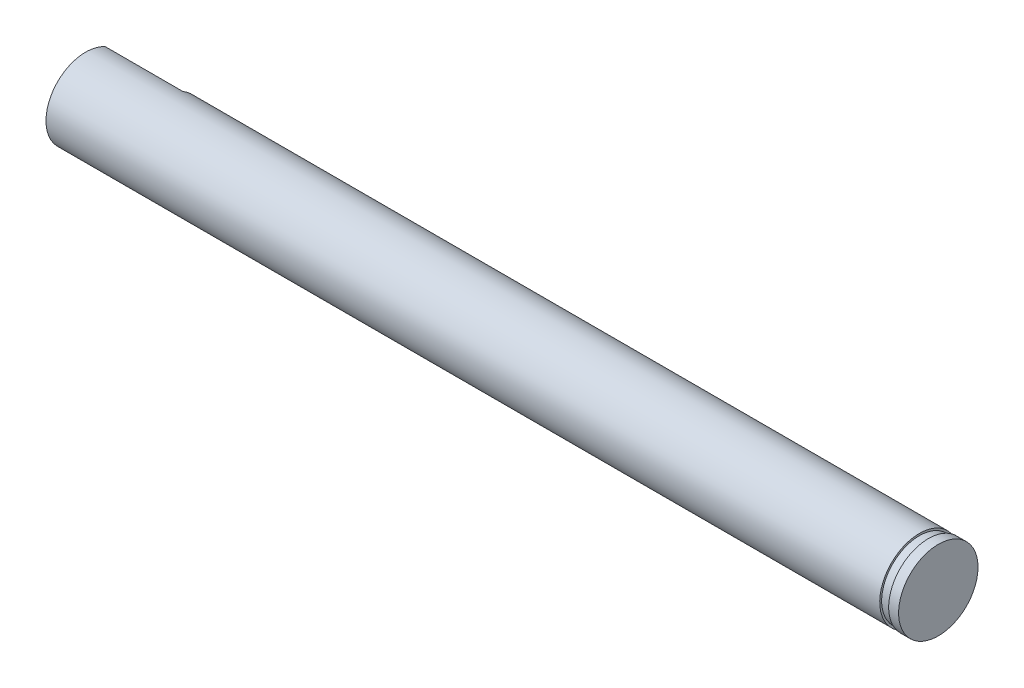
ISO-10303-21;
HEADER;
FILE_DESCRIPTION(('STEP AP214'),'2;1');
FILE_NAME('part.step','',(''),(''),'','','');
FILE_SCHEMA(('AUTOMOTIVE_DESIGN { 1 0 10303 214 1 1 1 1 }'));
ENDSEC;
DATA;
#1=APPLICATION_CONTEXT('core data for automotive mechanical design processes');
#2=APPLICATION_PROTOCOL_DEFINITION('international standard','automotive_design',2000,#1);
#3=PRODUCT_CONTEXT('',#1,'mechanical');
#4=PRODUCT('Part','Part','',(#3));
#5=PRODUCT_RELATED_PRODUCT_CATEGORY('part','',(#4));
#6=PRODUCT_DEFINITION_FORMATION('','',#4);
#7=PRODUCT_DEFINITION_CONTEXT('part definition',#1,'design');
#8=PRODUCT_DEFINITION('design','',#6,#7);
#9=PRODUCT_DEFINITION_SHAPE('','',#8);
#10=(LENGTH_UNIT() NAMED_UNIT(*) SI_UNIT(.MILLI.,.METRE.));
#11=(NAMED_UNIT(*) PLANE_ANGLE_UNIT() SI_UNIT($,.RADIAN.));
#12=(NAMED_UNIT(*) SI_UNIT($,.STERADIAN.) SOLID_ANGLE_UNIT());
#13=UNCERTAINTY_MEASURE_WITH_UNIT(LENGTH_MEASURE(1.E-05),#10,'distance_accuracy_value','');
#14=(GEOMETRIC_REPRESENTATION_CONTEXT(3) GLOBAL_UNCERTAINTY_ASSIGNED_CONTEXT((#13)) GLOBAL_UNIT_ASSIGNED_CONTEXT((#10,
#11,#12)) REPRESENTATION_CONTEXT('',''));
#15=CARTESIAN_POINT('',(0.,0.,0.));
#16=DIRECTION('',(0.,0.,1.));
#17=DIRECTION('',(1.,0.,0.));
#18=AXIS2_PLACEMENT_3D('',#15,#16,#17);
#19=CARTESIAN_POINT('',(7.8,0.,0.));
#20=DIRECTION('',(-1.,0.,0.));
#21=DIRECTION('',(0.,0.,1.));
#22=AXIS2_PLACEMENT_3D('',#19,#20,#21);
#23=CYLINDRICAL_SURFACE('',#22,3.995);
#24=CARTESIAN_POINT('',(42.381491960804,-1.1975052089103,-3.81129981431961));
#25=CARTESIAN_POINT('',(42.4713574015176,-1.25319253950466,-3.79380501860275));
#26=CARTESIAN_POINT('',(42.5663341456618,-1.30118639102685,-3.77739841673404));
#27=CARTESIAN_POINT('',(42.7634896865186,-1.38133452184056,-3.74883447909854));
#28=CARTESIAN_POINT('',(42.8656834792231,-1.41345464084264,-3.73668632369164));
#29=CARTESIAN_POINT('',(43.0747605714891,-1.46147391107286,-3.71817020591658));
#30=CARTESIAN_POINT('',(43.1816604872657,-1.47730981298283,-3.71182479238083));
#31=CARTESIAN_POINT('',(43.3967285483172,-1.49226454978916,-3.70583845963763));
#32=CARTESIAN_POINT('',(43.5048957360673,-1.49139528335876,-3.70619276838282));
#33=CARTESIAN_POINT('',(43.7208208843357,-1.47288114005323,-3.71358925429209));
#34=CARTESIAN_POINT('',(43.8285595317656,-1.45504171949156,-3.7207089883981));
#35=CARTESIAN_POINT('',(44.0393882100258,-1.4025682875874,-3.74080326090665));
#36=CARTESIAN_POINT('',(44.1424745282848,-1.36792111386892,-3.75378238732384));
#37=CARTESIAN_POINT('',(44.341153953554,-1.28214275089189,-3.78394018053836));
#38=CARTESIAN_POINT('',(44.4367312957334,-1.23097797585435,-3.80112738641008));
#39=CARTESIAN_POINT('',(44.6169373531185,-1.11256390393186,-3.83745307706257));
#40=CARTESIAN_POINT('',(44.7015777374288,-1.0453319717813,-3.85658944254614));
#41=CARTESIAN_POINT('',(44.8373508874119,-0.91356427354178,-3.88958238463659));
#42=CARTESIAN_POINT('',(44.8916368071862,-0.852308638054785,-3.90359660400785));
#43=CARTESIAN_POINT('',(44.9895889470589,-0.721496023599487,-3.92987254682183));
#44=CARTESIAN_POINT('',(45.0332699817221,-0.65195082978761,-3.94213670502848));
#45=CARTESIAN_POINT('',(45.1021446857779,-0.516656979987444,-3.96194937931374));
#46=CARTESIAN_POINT('',(45.1291218227468,-0.451882333205708,-3.96992798021932));
#47=CARTESIAN_POINT('',(45.1722766222879,-0.318524848111103,-3.98284341027105));
#48=CARTESIAN_POINT('',(45.1884601345866,-0.24994409442804,-3.98778188693486));
#49=CARTESIAN_POINT('',(45.2090338392156,-0.110599317822797,-3.99407932940051));
#50=CARTESIAN_POINT('',(45.2133816723781,-0.0398283674670583,-3.99542543800122));
#51=CARTESIAN_POINT('',(45.2098485494958,0.101376376133733,-3.99433750233281));
#52=CARTESIAN_POINT('',(45.2019677776458,0.171810174441146,-3.99190351500181));
#53=CARTESIAN_POINT('',(45.1753506789297,0.306033822903815,-3.98379585290602));
#54=CARTESIAN_POINT('',(45.1572804932983,0.369970734705371,-3.97832126288144));
#55=CARTESIAN_POINT('',(45.1118061655447,0.494123555900227,-3.96481672280448));
#56=CARTESIAN_POINT('',(45.084399851125,0.554338595445683,-3.95678617807022));
#57=CARTESIAN_POINT('',(45.0189276707623,0.674710914704593,-3.93812105989438));
#58=CARTESIAN_POINT('',(44.980179083253,0.734469845860698,-3.92732843488877));
#59=CARTESIAN_POINT('',(44.8947467828041,0.847715570944501,-3.90445228942322));
#60=CARTESIAN_POINT('',(44.8480589650874,0.901199096035889,-3.89236810240064));
#61=CARTESIAN_POINT('',(44.7391759903367,1.01047843122365,-3.86557461504662));
#62=CARTESIAN_POINT('',(44.675700724904,1.06497754986546,-3.85078229837205));
#63=CARTESIAN_POINT('',(44.5415171260316,1.16441283536304,-3.82189119371231));
#64=CARTESIAN_POINT('',(44.4708037461011,1.20934226195609,-3.8077928998898));
#65=CARTESIAN_POINT('',(44.3105937773164,1.29658453877428,-3.77907009124526));
#66=CARTESIAN_POINT('',(44.219996311956,1.33700213514369,-3.76480003832662));
#67=CARTESIAN_POINT('',(44.0332893203037,1.40396675431027,-3.74034416738793));
#68=CARTESIAN_POINT('',(43.9371778220249,1.43050878002874,-3.73015982108057));
#69=CARTESIAN_POINT('',(43.7333593255833,1.47108250976305,-3.71435987001567));
#70=CARTESIAN_POINT('',(43.625362344756,1.4838546801416,-3.70920781502992));
#71=CARTESIAN_POINT('',(43.4085961490788,1.49247664475161,-3.70574679335971));
#72=CARTESIAN_POINT('',(43.2998269440814,1.48832665449876,-3.70743773952479));
#73=CARTESIAN_POINT('',(43.0840167313289,1.46312087855249,-3.71745669983847));
#74=CARTESIAN_POINT('',(42.9769872936712,1.44197941427949,-3.72581834906227));
#75=CARTESIAN_POINT('',(42.7681613072729,1.38298173988407,-3.74811598745677));
#76=CARTESIAN_POINT('',(42.6663684776409,1.34511382850999,-3.76205587833183));
#77=CARTESIAN_POINT('',(42.4708775086538,1.25297875684519,-3.79373758887209));
#78=CARTESIAN_POINT('',(42.3771947903256,1.19868120051411,-3.8114864375368));
#79=CARTESIAN_POINT('',(42.2014712986715,1.07410871688875,-3.84844346017406));
#80=CARTESIAN_POINT('',(42.1194142908949,1.00385643351764,-3.86764954047398));
#81=CARTESIAN_POINT('',(41.9902421873671,0.868336254385489,-3.89993892738843));
#82=CARTESIAN_POINT('',(41.9395855940284,0.806506494976865,-3.9133176564035));
#83=CARTESIAN_POINT('',(41.8488681814469,0.675114190892883,-3.93810897611925));
#84=CARTESIAN_POINT('',(41.8087999706403,0.605557088976209,-3.94952293643974));
#85=CARTESIAN_POINT('',(41.7411861923368,0.459352439395802,-3.96919336691021));
#86=CARTESIAN_POINT('',(41.7137526706698,0.382648440245365,-3.97742148619987));
#87=CARTESIAN_POINT('',(41.674056459944,0.225078101100316,-3.98943288273328));
#88=CARTESIAN_POINT('',(41.6617768389165,0.144216511987835,-3.99322112056907));
#89=CARTESIAN_POINT('',(41.6540417957477,-0.0066782393031814,-3.99560317671381));
#90=CARTESIAN_POINT('',(41.6564216703574,-0.0765970855324641,-3.99486540364994));
#91=CARTESIAN_POINT('',(41.6728824952119,-0.214895561982822,-3.98981568190003));
#92=CARTESIAN_POINT('',(41.6869620718813,-0.283275371922893,-3.98550415278241));
#93=CARTESIAN_POINT('',(41.7251527846405,-0.413971493194789,-3.9740154692342));
#94=CARTESIAN_POINT('',(41.7488539140526,-0.476420098308998,-3.96695587277634));
#95=CARTESIAN_POINT('',(41.8050424815929,-0.596911545406124,-3.95062325142583));
#96=CARTESIAN_POINT('',(41.8375343507522,-0.654952146558015,-3.94134911055481));
#97=CARTESIAN_POINT('',(41.9143100607536,-0.772374334253337,-3.92013193420159));
#98=CARTESIAN_POINT('',(41.9595335037066,-0.831104300161134,-3.9080030364621));
#99=CARTESIAN_POINT('',(42.0576855454949,-0.941428134910564,-3.88290376341299));
#100=CARTESIAN_POINT('',(42.1106111053794,-0.993024802684642,-3.86993372109951));
#101=CARTESIAN_POINT('',(42.200371470877,-1.06970628097401,-3.849239266702));
#102=CARTESIAN_POINT('',(42.2352116388877,-1.09716122064237,-3.841484553706));
#103=CARTESIAN_POINT('',(42.3068979714378,-1.14936490939644,-3.82618917099743));
#104=CARTESIAN_POINT('',(42.343744043268,-1.1741137833925,-3.81864849141712));
#105=CARTESIAN_POINT('',(42.381491960804,-1.1975052089103,-3.81129981431961));
#106=B_SPLINE_CURVE_WITH_KNOTS('',3,(#24,#25,#26,#27,#28,#29,#30,#31,#32,#33,#34,#35,#36,#37,
#38,#39,#40,#41,#42,#43,#44,#45,#46,#47,#48,#49,#50,#51,#52,#53,#54,#55,#56,#57,#58,#59,#60,#61,
#62,#63,#64,#65,#66,#67,#68,#69,#70,#71,#72,#73,#74,#75,#76,#77,#78,#79,#80,#81,#82,#83,#84,#85,
#86,#87,#88,#89,#90,#91,#92,#93,#94,#95,#96,#97,#98,#99,#100,#101,#102,#103,#104,#105),
.UNSPECIFIED.,.T.,.F.,(4,2,2,2,2,2,2,2,2,2,2,2,2,2,2,2,2,2,2,2,2,2,2,2,2,2,2,2,2,2,2,2,2,2,2,2,
2,2,2,2,4),(0.,0.321310577263816,0.643309636522213,0.966554697492716,1.28956952763681,
1.61633255540053,1.94335188975466,2.27104039612087,2.59837633896329,2.84654929979132,
3.09437355275311,3.3053347090291,3.51618143942115,3.72778179131118,3.93937895597792,
4.13852366040947,4.33771473280933,4.55301182024959,4.76842056191574,5.02234809751947,
5.27645389586914,5.57587182715603,5.87539751516666,6.20046010439809,6.52551855374017,
6.85222645407007,7.17916327097555,7.50670868192671,7.83379209381451,8.07598926994491,
8.31801692315455,8.56215142653899,8.80601290243725,9.01481981369403,9.22360221393851,
9.42429162352065,9.62508238101617,9.84959404773278,10.0740173699911,10.2089898933381,
10.3439561838018),.UNSPECIFIED.);
#107=CARTESIAN_POINT('',(42.381491960804,-1.1975052089103,-3.81129981431961));
#108=VERTEX_POINT('',#107);
#109=EDGE_CURVE('E11',#108,#108,#106,.T.);
#110=ORIENTED_EDGE('',*,*,#109,.T.);
#111=EDGE_LOOP('',(#110));
#112=FACE_BOUND('',#111,.T.);
#113=CARTESIAN_POINT('',(0.,0.,0.));
#114=DIRECTION('',(1.,0.,0.));
#115=DIRECTION('',(0.,0.,-1.));
#116=AXIS2_PLACEMENT_3D('',#113,#114,#115);
#117=CIRCLE('',#116,3.995);
#118=CARTESIAN_POINT('',(0.,3.46695832106473,-1.985));
#119=VERTEX_POINT('',#118);
#120=CARTESIAN_POINT('',(0.,-3.46695832106473,-1.985));
#121=VERTEX_POINT('',#120);
#122=EDGE_CURVE('E95',#119,#121,#117,.T.);
#123=ORIENTED_EDGE('',*,*,#122,.T.);
#124=DIRECTION('',(-1.,0.,0.));
#125=VECTOR('',#124,1.);
#126=CARTESIAN_POINT('',(7.8,-3.46695832106473,-1.985));
#127=LINE('',#126,#125);
#128=CARTESIAN_POINT('',(7.8,-3.46695832106473,-1.985));
#129=VERTEX_POINT('',#128);
#130=EDGE_CURVE('E62',#129,#121,#127,.T.);
#131=ORIENTED_EDGE('',*,*,#130,.F.);
#132=CARTESIAN_POINT('',(7.8,0.,0.));
#133=DIRECTION('',(1.,0.,0.));
#134=DIRECTION('',(0.,0.,-1.));
#135=AXIS2_PLACEMENT_3D('',#132,#133,#134);
#136=CIRCLE('',#135,3.995);
#137=CARTESIAN_POINT('',(7.8,3.46695832106473,-1.985));
#138=VERTEX_POINT('',#137);
#139=EDGE_CURVE('E101',#129,#138,#136,.T.);
#140=ORIENTED_EDGE('',*,*,#139,.T.);
#141=DIRECTION('',(-1.,0.,0.));
#142=VECTOR('',#141,1.);
#143=CARTESIAN_POINT('',(7.8,3.46695832106473,-1.985));
#144=LINE('',#143,#142);
#145=EDGE_CURVE('E82',#138,#119,#144,.T.);
#146=ORIENTED_EDGE('',*,*,#145,.T.);
#147=EDGE_LOOP('',(#123,#131,#140,#146));
#148=FACE_BOUND('',#147,.T.);
#149=CARTESIAN_POINT('',(83.9,0.,0.));
#150=DIRECTION('',(1.,0.,0.));
#151=DIRECTION('',(0.,0.,-1.));
#152=AXIS2_PLACEMENT_3D('',#149,#150,#151);
#153=CIRCLE('',#152,3.995);
#154=CARTESIAN_POINT('',(83.9,0.,-3.995));
#155=VERTEX_POINT('',#154);
#156=EDGE_CURVE('E98',#155,#155,#153,.T.);
#157=ORIENTED_EDGE('',*,*,#156,.F.);
#158=EDGE_LOOP('',(#157));
#159=FACE_BOUND('',#158,.T.);
#160=ADVANCED_FACE('F47',(#112,#148,#159),#23,.T.);
#161=CARTESIAN_POINT('',(7.8,3.46695832106473,-1.985));
#162=DIRECTION('',(0.,0.,1.));
#163=DIRECTION('',(1.,0.,0.));
#164=AXIS2_PLACEMENT_3D('',#161,#162,#163);
#165=PLANE('',#164);
#166=DIRECTION('',(0.,1.,0.));
#167=VECTOR('',#166,1.);
#168=CARTESIAN_POINT('',(0.,3.46695832106473,-1.985));
#169=LINE('',#168,#167);
#170=EDGE_CURVE('E79',#121,#119,#169,.T.);
#171=ORIENTED_EDGE('',*,*,#170,.T.);
#172=ORIENTED_EDGE('',*,*,#145,.F.);
#173=DIRECTION('',(0.,1.,0.));
#174=VECTOR('',#173,1.);
#175=CARTESIAN_POINT('',(7.8,3.46695832106473,-1.985));
#176=LINE('',#175,#174);
#177=EDGE_CURVE('E69',#129,#138,#176,.T.);
#178=ORIENTED_EDGE('',*,*,#177,.F.);
#179=ORIENTED_EDGE('',*,*,#130,.T.);
#180=EDGE_LOOP('',(#171,#172,#178,#179));
#181=FACE_BOUND('',#180,.T.);
#182=ADVANCED_FACE('F92',(#181),#165,.F.);
#183=CARTESIAN_POINT('',(0.,0.,0.));
#184=DIRECTION('',(1.,0.,0.));
#185=DIRECTION('',(0.,0.,-1.));
#186=AXIS2_PLACEMENT_3D('',#183,#184,#185);
#187=PLANE('',#186);
#188=ORIENTED_EDGE('',*,*,#122,.F.);
#189=ORIENTED_EDGE('',*,*,#170,.F.);
#190=EDGE_LOOP('',(#188,#189));
#191=FACE_BOUND('',#190,.T.);
#192=ADVANCED_FACE('F148',(#191),#187,.F.);
#193=CARTESIAN_POINT('',(7.8,0.,0.));
#194=DIRECTION('',(1.,0.,0.));
#195=DIRECTION('',(0.,0.,-1.));
#196=AXIS2_PLACEMENT_3D('',#193,#194,#195);
#197=PLANE('',#196);
#198=ORIENTED_EDGE('',*,*,#139,.F.);
#199=ORIENTED_EDGE('',*,*,#177,.T.);
#200=EDGE_LOOP('',(#198,#199));
#201=FACE_BOUND('',#200,.T.);
#202=ADVANCED_FACE('F139',(#201),#197,.F.);
#203=CARTESIAN_POINT('',(83.9,0.,0.));
#204=DIRECTION('',(1.,0.,0.));
#205=DIRECTION('',(0.,0.,-1.));
#206=AXIS2_PLACEMENT_3D('',#203,#204,#205);
#207=PLANE('',#206);
#208=CARTESIAN_POINT('',(83.9,0.,0.));
#209=DIRECTION('',(1.,0.,0.));
#210=DIRECTION('',(0.,0.,-1.));
#211=AXIS2_PLACEMENT_3D('',#208,#209,#210);
#212=CIRCLE('',#211,3.8);
#213=CARTESIAN_POINT('',(83.9,0.,-3.8));
#214=VERTEX_POINT('',#213);
#215=EDGE_CURVE('E109',#214,#214,#212,.T.);
#216=ORIENTED_EDGE('',*,*,#215,.F.);
#217=EDGE_LOOP('',(#216));
#218=FACE_BOUND('',#217,.T.);
#219=ORIENTED_EDGE('',*,*,#156,.T.);
#220=EDGE_LOOP('',(#219));
#221=FACE_BOUND('',#220,.T.);
#222=ADVANCED_FACE('F136',(#218,#221),#207,.T.);
#223=CARTESIAN_POINT('',(84.8,0.,0.));
#224=DIRECTION('',(1.,0.,0.));
#225=DIRECTION('',(0.,0.,-1.));
#226=AXIS2_PLACEMENT_3D('',#223,#224,#225);
#227=PLANE('',#226);
#228=CARTESIAN_POINT('',(84.8,0.,0.));
#229=DIRECTION('',(1.,0.,0.));
#230=DIRECTION('',(0.,0.,-1.));
#231=AXIS2_PLACEMENT_3D('',#228,#229,#230);
#232=CIRCLE('',#231,3.8);
#233=CARTESIAN_POINT('',(84.8,0.,-3.8));
#234=VERTEX_POINT('',#233);
#235=EDGE_CURVE('E125',#234,#234,#232,.T.);
#236=ORIENTED_EDGE('',*,*,#235,.T.);
#237=EDGE_LOOP('',(#236));
#238=FACE_BOUND('',#237,.T.);
#239=CARTESIAN_POINT('',(84.8,0.,0.));
#240=DIRECTION('',(1.,0.,0.));
#241=DIRECTION('',(0.,0.,-1.));
#242=AXIS2_PLACEMENT_3D('',#239,#240,#241);
#243=CIRCLE('',#242,3.995);
#244=CARTESIAN_POINT('',(84.8,0.,-3.995));
#245=VERTEX_POINT('',#244);
#246=EDGE_CURVE('E102',#245,#245,#243,.T.);
#247=ORIENTED_EDGE('',*,*,#246,.F.);
#248=EDGE_LOOP('',(#247));
#249=FACE_BOUND('',#248,.T.);
#250=ADVANCED_FACE('F138',(#238,#249),#227,.F.);
#251=CARTESIAN_POINT('',(83.9,0.,0.));
#252=DIRECTION('',(1.,0.,0.));
#253=DIRECTION('',(0.,0.,-1.));
#254=AXIS2_PLACEMENT_3D('',#251,#252,#253);
#255=CYLINDRICAL_SURFACE('',#254,3.8);
#256=ORIENTED_EDGE('',*,*,#215,.T.);
#257=EDGE_LOOP('',(#256));
#258=FACE_BOUND('',#257,.T.);
#259=ORIENTED_EDGE('',*,*,#235,.F.);
#260=EDGE_LOOP('',(#259));
#261=FACE_BOUND('',#260,.T.);
#262=ADVANCED_FACE('F133',(#258,#261),#255,.T.);
#263=CARTESIAN_POINT('',(85.8,0.,0.));
#264=DIRECTION('',(1.,0.,0.));
#265=DIRECTION('',(0.,0.,-1.));
#266=AXIS2_PLACEMENT_3D('',#263,#264,#265);
#267=PLANE('',#266);
#268=CARTESIAN_POINT('',(85.8,0.,0.));
#269=DIRECTION('',(1.,0.,0.));
#270=DIRECTION('',(0.,0.,-1.));
#271=AXIS2_PLACEMENT_3D('',#268,#269,#270);
#272=CIRCLE('',#271,3.995);
#273=CARTESIAN_POINT('',(85.8,0.,-3.995));
#274=VERTEX_POINT('',#273);
#275=EDGE_CURVE('E106',#274,#274,#272,.T.);
#276=ORIENTED_EDGE('',*,*,#275,.T.);
#277=EDGE_LOOP('',(#276));
#278=FACE_BOUND('',#277,.T.);
#279=ADVANCED_FACE('F153',(#278),#267,.T.);
#280=ORIENTED_EDGE('',*,*,#246,.T.);
#281=EDGE_LOOP('',(#280));
#282=FACE_BOUND('',#281,.T.);
#283=ORIENTED_EDGE('',*,*,#275,.F.);
#284=EDGE_LOOP('',(#283));
#285=FACE_BOUND('',#284,.T.);
#286=ADVANCED_FACE('F49',(#282,#285),#23,.T.);
#287=CARTESIAN_POINT('',(43.434,0.,-3.995));
#288=DIRECTION('',(0.,0.,-1.));
#289=DIRECTION('',(-1.,0.,0.));
#290=AXIS2_PLACEMENT_3D('',#287,#288,#289);
#291=CONICAL_SURFACE('',#290,1.778,0.78539816339745);
#292=CARTESIAN_POINT('',(43.434,0.,-2.21700000000001));
#293=VERTEX_POINT('',#292);
#294=VERTEX_LOOP('',#293);
#295=FACE_BOUND('',#294,.T.);
#296=ORIENTED_EDGE('',*,*,#109,.F.);
#297=EDGE_LOOP('',(#296));
#298=FACE_BOUND('',#297,.T.);
#299=ADVANCED_FACE('F85',(#295,#298),#291,.F.);
#300=CLOSED_SHELL('',(#160,#182,#192,#202,#222,#250,#262,#279,#286,#299));
#301=MANIFOLD_SOLID_BREP('B2',#300);
#302=ADVANCED_BREP_SHAPE_REPRESENTATION('',(#18,#301),#14);
#303=SHAPE_DEFINITION_REPRESENTATION(#9,#302);
ENDSEC;
END-ISO-10303-21;
